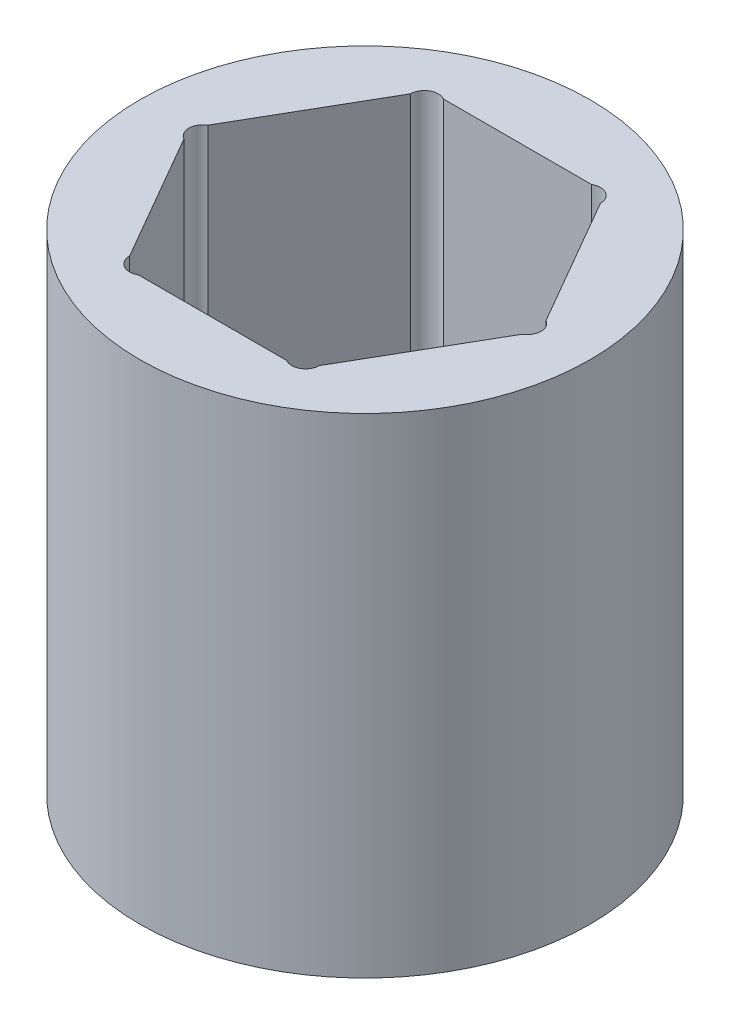
ISO-10303-21;
HEADER;
FILE_DESCRIPTION(('STEP AP214'),'2;1');
FILE_NAME('part.step','',(''),(''),'','','');
FILE_SCHEMA(('AUTOMOTIVE_DESIGN { 1 0 10303 214 1 1 1 1 }'));
ENDSEC;
DATA;
#1=APPLICATION_CONTEXT('core data for automotive mechanical design processes');
#2=APPLICATION_PROTOCOL_DEFINITION('international standard','automotive_design',2000,#1);
#3=PRODUCT_CONTEXT('',#1,'mechanical');
#4=PRODUCT('Part','Part','',(#3));
#5=PRODUCT_RELATED_PRODUCT_CATEGORY('part','',(#4));
#6=PRODUCT_DEFINITION_FORMATION('','',#4);
#7=PRODUCT_DEFINITION_CONTEXT('part definition',#1,'design');
#8=PRODUCT_DEFINITION('design','',#6,#7);
#9=PRODUCT_DEFINITION_SHAPE('','',#8);
#10=(LENGTH_UNIT() NAMED_UNIT(*) SI_UNIT(.MILLI.,.METRE.));
#11=(NAMED_UNIT(*) PLANE_ANGLE_UNIT() SI_UNIT($,.RADIAN.));
#12=(NAMED_UNIT(*) SI_UNIT($,.STERADIAN.) SOLID_ANGLE_UNIT());
#13=UNCERTAINTY_MEASURE_WITH_UNIT(LENGTH_MEASURE(1.E-05),#10,'distance_accuracy_value','');
#14=(GEOMETRIC_REPRESENTATION_CONTEXT(3) GLOBAL_UNCERTAINTY_ASSIGNED_CONTEXT((#13)) GLOBAL_UNIT_ASSIGNED_CONTEXT((#10,
#11,#12)) REPRESENTATION_CONTEXT('',''));
#15=CARTESIAN_POINT('',(0.,0.,0.));
#16=DIRECTION('',(0.,0.,1.));
#17=DIRECTION('',(1.,0.,0.));
#18=AXIS2_PLACEMENT_3D('',#15,#16,#17);
#19=CARTESIAN_POINT('',(-3.5128211777283,21.1836,-6.08438475772933));
#20=DIRECTION('',(0.,-1.,0.));
#21=DIRECTION('',(0.,0.,-1.));
#22=AXIS2_PLACEMENT_3D('',#19,#20,#21);
#23=CYLINDRICAL_SURFACE('',#22,0.600000000000001);
#24=CARTESIAN_POINT('',(-3.5128211777283,0.,-6.08438475772933));
#25=DIRECTION('',(0.,1.,0.));
#26=DIRECTION('',(0.,0.,1.));
#27=AXIS2_PLACEMENT_3D('',#24,#25,#26);
#28=CIRCLE('',#27,0.600000000000001);
#29=CARTESIAN_POINT('',(-3.2128211777283,0.,-6.604));
#30=VERTEX_POINT('',#29);
#31=CARTESIAN_POINT('',(-4.1128211777283,0.,-6.08438475772932));
#32=VERTEX_POINT('',#31);
#33=EDGE_CURVE('E158',#30,#32,#28,.T.);
#34=ORIENTED_EDGE('',*,*,#33,.F.);
#35=DIRECTION('',(0.,-1.,0.));
#36=VECTOR('',#35,1.);
#37=CARTESIAN_POINT('',(-3.2128211777283,21.1836,-6.604));
#38=LINE('',#37,#36);
#39=CARTESIAN_POINT('',(-3.2128211777283,21.1836,-6.604));
#40=VERTEX_POINT('',#39);
#41=EDGE_CURVE('E11',#40,#30,#38,.T.);
#42=ORIENTED_EDGE('',*,*,#41,.F.);
#43=CARTESIAN_POINT('',(-3.5128211777283,21.1836,-6.08438475772933));
#44=DIRECTION('',(0.,1.,0.));
#45=DIRECTION('',(0.,0.,1.));
#46=AXIS2_PLACEMENT_3D('',#43,#44,#45);
#47=CIRCLE('',#46,0.600000000000001);
#48=CARTESIAN_POINT('',(-4.1128211777283,21.1836,-6.08438475772932));
#49=VERTEX_POINT('',#48);
#50=EDGE_CURVE('E193',#40,#49,#47,.T.);
#51=ORIENTED_EDGE('',*,*,#50,.T.);
#52=DIRECTION('',(0.,-1.,0.));
#53=VECTOR('',#52,1.);
#54=CARTESIAN_POINT('',(-4.1128211777283,21.1836,-6.08438475772932));
#55=LINE('',#54,#53);
#56=EDGE_CURVE('E53',#49,#32,#55,.T.);
#57=ORIENTED_EDGE('',*,*,#56,.T.);
#58=EDGE_LOOP('',(#34,#42,#51,#57));
#59=FACE_BOUND('',#58,.T.);
#60=ADVANCED_FACE('F37',(#59),#23,.F.);
#61=CARTESIAN_POINT('',(0.,21.1836,-6.604));
#62=DIRECTION('',(0.,0.,1.));
#63=DIRECTION('',(1.,0.,0.));
#64=AXIS2_PLACEMENT_3D('',#61,#62,#63);
#65=PLANE('',#64);
#66=DIRECTION('',(-1.,0.,0.));
#67=VECTOR('',#66,1.);
#68=CARTESIAN_POINT('',(0.,0.,-6.604));
#69=LINE('',#68,#67);
#70=CARTESIAN_POINT('',(3.21282117772828,0.,-6.604));
#71=VERTEX_POINT('',#70);
#72=EDGE_CURVE('E160',#71,#30,#69,.T.);
#73=ORIENTED_EDGE('',*,*,#72,.F.);
#74=DIRECTION('',(0.,-1.,0.));
#75=VECTOR('',#74,1.);
#76=CARTESIAN_POINT('',(3.21282117772828,21.1836,-6.604));
#77=LINE('',#76,#75);
#78=CARTESIAN_POINT('',(3.21282117772828,21.1836,-6.604));
#79=VERTEX_POINT('',#78);
#80=EDGE_CURVE('E45',#79,#71,#77,.T.);
#81=ORIENTED_EDGE('',*,*,#80,.F.);
#82=DIRECTION('',(-1.,0.,0.));
#83=VECTOR('',#82,1.);
#84=CARTESIAN_POINT('',(0.,21.1836,-6.604));
#85=LINE('',#84,#83);
#86=EDGE_CURVE('E231',#79,#40,#85,.T.);
#87=ORIENTED_EDGE('',*,*,#86,.T.);
#88=ORIENTED_EDGE('',*,*,#41,.T.);
#89=EDGE_LOOP('',(#73,#81,#87,#88));
#90=FACE_BOUND('',#89,.T.);
#91=ADVANCED_FACE('F218',(#90),#65,.T.);
#92=CARTESIAN_POINT('',(3.51282117772829,21.1836,-6.08438475772934));
#93=DIRECTION('',(0.,-1.,0.));
#94=DIRECTION('',(0.,0.,-1.));
#95=AXIS2_PLACEMENT_3D('',#92,#93,#94);
#96=CYLINDRICAL_SURFACE('',#95,0.600000000000001);
#97=CARTESIAN_POINT('',(3.51282117772829,0.,-6.08438475772934));
#98=DIRECTION('',(0.,1.,0.));
#99=DIRECTION('',(0.,0.,1.));
#100=AXIS2_PLACEMENT_3D('',#97,#98,#99);
#101=CIRCLE('',#100,0.600000000000001);
#102=CARTESIAN_POINT('',(4.11282117772829,0.,-6.08438475772934));
#103=VERTEX_POINT('',#102);
#104=EDGE_CURVE('E163',#103,#71,#101,.T.);
#105=ORIENTED_EDGE('',*,*,#104,.F.);
#106=DIRECTION('',(0.,-1.,0.));
#107=VECTOR('',#106,1.);
#108=CARTESIAN_POINT('',(4.11282117772829,21.1836,-6.08438475772934));
#109=LINE('',#108,#107);
#110=CARTESIAN_POINT('',(4.11282117772829,21.1836,-6.08438475772934));
#111=VERTEX_POINT('',#110);
#112=EDGE_CURVE('E207',#111,#103,#109,.T.);
#113=ORIENTED_EDGE('',*,*,#112,.F.);
#114=CARTESIAN_POINT('',(3.51282117772829,21.1836,-6.08438475772934));
#115=DIRECTION('',(0.,1.,0.));
#116=DIRECTION('',(0.,0.,1.));
#117=AXIS2_PLACEMENT_3D('',#114,#115,#116);
#118=CIRCLE('',#117,0.600000000000001);
#119=EDGE_CURVE('E214',#111,#79,#118,.T.);
#120=ORIENTED_EDGE('',*,*,#119,.T.);
#121=ORIENTED_EDGE('',*,*,#80,.T.);
#122=EDGE_LOOP('',(#105,#113,#120,#121));
#123=FACE_BOUND('',#122,.T.);
#124=ADVANCED_FACE('F212',(#123),#96,.F.);
#125=CARTESIAN_POINT('',(5.71923176659243,21.1836,-3.302));
#126=DIRECTION('',(-0.866025403784438,0.,0.5));
#127=DIRECTION('',(0.5,0.,0.866025403784438));
#128=AXIS2_PLACEMENT_3D('',#125,#126,#127);
#129=PLANE('',#128);
#130=DIRECTION('',(-0.5,0.,-0.866025403784438));
#131=VECTOR('',#130,1.);
#132=CARTESIAN_POINT('',(5.71923176659243,0.,-3.302));
#133=LINE('',#132,#131);
#134=CARTESIAN_POINT('',(7.32564235545658,0.,-0.519615242270668));
#135=VERTEX_POINT('',#134);
#136=EDGE_CURVE('E166',#135,#103,#133,.T.);
#137=ORIENTED_EDGE('',*,*,#136,.F.);
#138=DIRECTION('',(0.,-1.,0.));
#139=VECTOR('',#138,1.);
#140=CARTESIAN_POINT('',(7.32564235545658,21.1836,-0.519615242270668));
#141=LINE('',#140,#139);
#142=CARTESIAN_POINT('',(7.32564235545658,21.1836,-0.519615242270668));
#143=VERTEX_POINT('',#142);
#144=EDGE_CURVE('E205',#143,#135,#141,.T.);
#145=ORIENTED_EDGE('',*,*,#144,.F.);
#146=DIRECTION('',(-0.5,0.,-0.866025403784438));
#147=VECTOR('',#146,1.);
#148=CARTESIAN_POINT('',(5.71923176659243,21.1836,-3.302));
#149=LINE('',#148,#147);
#150=EDGE_CURVE('E228',#143,#111,#149,.T.);
#151=ORIENTED_EDGE('',*,*,#150,.T.);
#152=ORIENTED_EDGE('',*,*,#112,.T.);
#153=EDGE_LOOP('',(#137,#145,#151,#152));
#154=FACE_BOUND('',#153,.T.);
#155=ADVANCED_FACE('F225',(#154),#129,.T.);
#156=CARTESIAN_POINT('',(7.02564235545658,21.1836,0.));
#157=DIRECTION('',(0.,-1.,0.));
#158=DIRECTION('',(0.,0.,-1.));
#159=AXIS2_PLACEMENT_3D('',#156,#157,#158);
#160=CYLINDRICAL_SURFACE('',#159,0.6);
#161=CARTESIAN_POINT('',(7.02564235545658,0.,0.));
#162=DIRECTION('',(0.,1.,0.));
#163=DIRECTION('',(0.,0.,1.));
#164=AXIS2_PLACEMENT_3D('',#161,#162,#163);
#165=CIRCLE('',#164,0.6);
#166=CARTESIAN_POINT('',(7.32564235545658,0.,0.519615242270659));
#167=VERTEX_POINT('',#166);
#168=EDGE_CURVE('E169',#167,#135,#165,.T.);
#169=ORIENTED_EDGE('',*,*,#168,.F.);
#170=DIRECTION('',(0.,-1.,0.));
#171=VECTOR('',#170,1.);
#172=CARTESIAN_POINT('',(7.32564235545658,21.1836,0.519615242270659));
#173=LINE('',#172,#171);
#174=CARTESIAN_POINT('',(7.32564235545658,21.1836,0.519615242270659));
#175=VERTEX_POINT('',#174);
#176=EDGE_CURVE('E203',#175,#167,#173,.T.);
#177=ORIENTED_EDGE('',*,*,#176,.F.);
#178=CARTESIAN_POINT('',(7.02564235545658,21.1836,0.));
#179=DIRECTION('',(0.,1.,0.));
#180=DIRECTION('',(0.,0.,1.));
#181=AXIS2_PLACEMENT_3D('',#178,#179,#180);
#182=CIRCLE('',#181,0.6);
#183=EDGE_CURVE('E233',#175,#143,#182,.T.);
#184=ORIENTED_EDGE('',*,*,#183,.T.);
#185=ORIENTED_EDGE('',*,*,#144,.T.);
#186=EDGE_LOOP('',(#169,#177,#184,#185));
#187=FACE_BOUND('',#186,.T.);
#188=ADVANCED_FACE('F273',(#187),#160,.F.);
#189=CARTESIAN_POINT('',(5.71923176659244,21.1836,3.302));
#190=DIRECTION('',(-0.866025403784439,0.,-0.499999999999999));
#191=DIRECTION('',(-0.499999999999999,0.,0.866025403784439));
#192=AXIS2_PLACEMENT_3D('',#189,#190,#191);
#193=PLANE('',#192);
#194=DIRECTION('',(0.499999999999999,0.,-0.866025403784439));
#195=VECTOR('',#194,1.);
#196=CARTESIAN_POINT('',(5.71923176659244,0.,3.302));
#197=LINE('',#196,#195);
#198=CARTESIAN_POINT('',(4.11282117772829,0.,6.08438475772933));
#199=VERTEX_POINT('',#198);
#200=EDGE_CURVE('E172',#199,#167,#197,.T.);
#201=ORIENTED_EDGE('',*,*,#200,.F.);
#202=DIRECTION('',(0.,-1.,0.));
#203=VECTOR('',#202,1.);
#204=CARTESIAN_POINT('',(4.11282117772829,21.1836,6.08438475772933));
#205=LINE('',#204,#203);
#206=CARTESIAN_POINT('',(4.11282117772829,21.1836,6.08438475772933));
#207=VERTEX_POINT('',#206);
#208=EDGE_CURVE('E201',#207,#199,#205,.T.);
#209=ORIENTED_EDGE('',*,*,#208,.F.);
#210=DIRECTION('',(0.499999999999999,0.,-0.866025403784439));
#211=VECTOR('',#210,1.);
#212=CARTESIAN_POINT('',(5.71923176659244,21.1836,3.302));
#213=LINE('',#212,#211);
#214=EDGE_CURVE('E239',#207,#175,#213,.T.);
#215=ORIENTED_EDGE('',*,*,#214,.T.);
#216=ORIENTED_EDGE('',*,*,#176,.T.);
#217=EDGE_LOOP('',(#201,#209,#215,#216));
#218=FACE_BOUND('',#217,.T.);
#219=ADVANCED_FACE('F276',(#218),#193,.T.);
#220=CARTESIAN_POINT('',(3.51282117772829,21.1836,6.08438475772933));
#221=DIRECTION('',(0.,-1.,0.));
#222=DIRECTION('',(0.,0.,-1.));
#223=AXIS2_PLACEMENT_3D('',#220,#221,#222);
#224=CYLINDRICAL_SURFACE('',#223,0.600000000000001);
#225=CARTESIAN_POINT('',(3.51282117772829,0.,6.08438475772933));
#226=DIRECTION('',(0.,1.,0.));
#227=DIRECTION('',(0.,0.,1.));
#228=AXIS2_PLACEMENT_3D('',#225,#226,#227);
#229=CIRCLE('',#228,0.600000000000001);
#230=CARTESIAN_POINT('',(3.21282117772829,0.,6.604));
#231=VERTEX_POINT('',#230);
#232=EDGE_CURVE('E175',#231,#199,#229,.T.);
#233=ORIENTED_EDGE('',*,*,#232,.F.);
#234=DIRECTION('',(0.,-1.,0.));
#235=VECTOR('',#234,1.);
#236=CARTESIAN_POINT('',(3.21282117772829,21.1836,6.604));
#237=LINE('',#236,#235);
#238=CARTESIAN_POINT('',(3.21282117772829,21.1836,6.604));
#239=VERTEX_POINT('',#238);
#240=EDGE_CURVE('E199',#239,#231,#237,.T.);
#241=ORIENTED_EDGE('',*,*,#240,.F.);
#242=CARTESIAN_POINT('',(3.51282117772829,21.1836,6.08438475772933));
#243=DIRECTION('',(0.,1.,0.));
#244=DIRECTION('',(0.,0.,1.));
#245=AXIS2_PLACEMENT_3D('',#242,#243,#244);
#246=CIRCLE('',#245,0.600000000000001);
#247=EDGE_CURVE('E242',#239,#207,#246,.T.);
#248=ORIENTED_EDGE('',*,*,#247,.T.);
#249=ORIENTED_EDGE('',*,*,#208,.T.);
#250=EDGE_LOOP('',(#233,#241,#248,#249));
#251=FACE_BOUND('',#250,.T.);
#252=ADVANCED_FACE('F280',(#251),#224,.F.);
#253=CARTESIAN_POINT('',(0.,21.1836,6.604));
#254=DIRECTION('',(0.,0.,-1.));
#255=DIRECTION('',(-1.,0.,0.));
#256=AXIS2_PLACEMENT_3D('',#253,#254,#255);
#257=PLANE('',#256);
#258=DIRECTION('',(1.,0.,0.));
#259=VECTOR('',#258,1.);
#260=CARTESIAN_POINT('',(0.,0.,6.604));
#261=LINE('',#260,#259);
#262=CARTESIAN_POINT('',(-3.21282117772829,0.,6.604));
#263=VERTEX_POINT('',#262);
#264=EDGE_CURVE('E178',#263,#231,#261,.T.);
#265=ORIENTED_EDGE('',*,*,#264,.F.);
#266=DIRECTION('',(0.,-1.,0.));
#267=VECTOR('',#266,1.);
#268=CARTESIAN_POINT('',(-3.21282117772829,21.1836,6.604));
#269=LINE('',#268,#267);
#270=CARTESIAN_POINT('',(-3.21282117772829,21.1836,6.604));
#271=VERTEX_POINT('',#270);
#272=EDGE_CURVE('E197',#271,#263,#269,.T.);
#273=ORIENTED_EDGE('',*,*,#272,.F.);
#274=DIRECTION('',(1.,0.,0.));
#275=VECTOR('',#274,1.);
#276=CARTESIAN_POINT('',(0.,21.1836,6.604));
#277=LINE('',#276,#275);
#278=EDGE_CURVE('E245',#271,#239,#277,.T.);
#279=ORIENTED_EDGE('',*,*,#278,.T.);
#280=ORIENTED_EDGE('',*,*,#240,.T.);
#281=EDGE_LOOP('',(#265,#273,#279,#280));
#282=FACE_BOUND('',#281,.T.);
#283=ADVANCED_FACE('F284',(#282),#257,.T.);
#284=CARTESIAN_POINT('',(-3.51282117772829,21.1836,6.08438475772934));
#285=DIRECTION('',(0.,-1.,0.));
#286=DIRECTION('',(0.,0.,-1.));
#287=AXIS2_PLACEMENT_3D('',#284,#285,#286);
#288=CYLINDRICAL_SURFACE('',#287,0.6);
#289=CARTESIAN_POINT('',(-3.51282117772829,0.,6.08438475772934));
#290=DIRECTION('',(0.,1.,0.));
#291=DIRECTION('',(0.,0.,1.));
#292=AXIS2_PLACEMENT_3D('',#289,#290,#291);
#293=CIRCLE('',#292,0.6);
#294=CARTESIAN_POINT('',(-4.11282117772828,0.,6.08438475772934));
#295=VERTEX_POINT('',#294);
#296=EDGE_CURVE('E181',#295,#263,#293,.T.);
#297=ORIENTED_EDGE('',*,*,#296,.F.);
#298=DIRECTION('',(0.,-1.,0.));
#299=VECTOR('',#298,1.);
#300=CARTESIAN_POINT('',(-4.11282117772828,21.1836,6.08438475772934));
#301=LINE('',#300,#299);
#302=CARTESIAN_POINT('',(-4.11282117772828,21.1836,6.08438475772934));
#303=VERTEX_POINT('',#302);
#304=EDGE_CURVE('E136',#303,#295,#301,.T.);
#305=ORIENTED_EDGE('',*,*,#304,.F.);
#306=CARTESIAN_POINT('',(-3.51282117772829,21.1836,6.08438475772934));
#307=DIRECTION('',(0.,1.,0.));
#308=DIRECTION('',(0.,0.,1.));
#309=AXIS2_PLACEMENT_3D('',#306,#307,#308);
#310=CIRCLE('',#309,0.6);
#311=EDGE_CURVE('E147',#303,#271,#310,.T.);
#312=ORIENTED_EDGE('',*,*,#311,.T.);
#313=ORIENTED_EDGE('',*,*,#272,.T.);
#314=EDGE_LOOP('',(#297,#305,#312,#313));
#315=FACE_BOUND('',#314,.T.);
#316=ADVANCED_FACE('F249',(#315),#288,.F.);
#317=CARTESIAN_POINT('',(-5.71923176659243,21.1836,3.302));
#318=DIRECTION('',(0.866025403784438,0.,-0.500000000000001));
#319=DIRECTION('',(-0.500000000000001,0.,-0.866025403784438));
#320=AXIS2_PLACEMENT_3D('',#317,#318,#319);
#321=PLANE('',#320);
#322=DIRECTION('',(0.500000000000001,0.,0.866025403784438));
#323=VECTOR('',#322,1.);
#324=CARTESIAN_POINT('',(-5.71923176659243,0.,3.302));
#325=LINE('',#324,#323);
#326=CARTESIAN_POINT('',(-7.32564235545657,0.,0.519615242270671));
#327=VERTEX_POINT('',#326);
#328=EDGE_CURVE('E132',#327,#295,#325,.T.);
#329=ORIENTED_EDGE('',*,*,#328,.F.);
#330=DIRECTION('',(0.,-1.,0.));
#331=VECTOR('',#330,1.);
#332=CARTESIAN_POINT('',(-7.32564235545657,21.1836,0.519615242270671));
#333=LINE('',#332,#331);
#334=CARTESIAN_POINT('',(-7.32564235545657,21.1836,0.519615242270671));
#335=VERTEX_POINT('',#334);
#336=EDGE_CURVE('E127',#335,#327,#333,.T.);
#337=ORIENTED_EDGE('',*,*,#336,.F.);
#338=DIRECTION('',(0.500000000000001,0.,0.866025403784438));
#339=VECTOR('',#338,1.);
#340=CARTESIAN_POINT('',(-5.71923176659243,21.1836,3.302));
#341=LINE('',#340,#339);
#342=EDGE_CURVE('E130',#335,#303,#341,.T.);
#343=ORIENTED_EDGE('',*,*,#342,.T.);
#344=ORIENTED_EDGE('',*,*,#304,.T.);
#345=EDGE_LOOP('',(#329,#337,#343,#344));
#346=FACE_BOUND('',#345,.T.);
#347=ADVANCED_FACE('F129',(#346),#321,.T.);
#348=CARTESIAN_POINT('',(-7.02564235545658,21.1836,0.));
#349=DIRECTION('',(0.,-1.,0.));
#350=DIRECTION('',(0.,0.,-1.));
#351=AXIS2_PLACEMENT_3D('',#348,#349,#350);
#352=CYLINDRICAL_SURFACE('',#351,0.6);
#353=CARTESIAN_POINT('',(-7.02564235545658,0.,0.));
#354=DIRECTION('',(0.,1.,0.));
#355=DIRECTION('',(0.,0.,1.));
#356=AXIS2_PLACEMENT_3D('',#353,#354,#355);
#357=CIRCLE('',#356,0.6);
#358=CARTESIAN_POINT('',(-7.32564235545658,0.,-0.519615242270657));
#359=VERTEX_POINT('',#358);
#360=EDGE_CURVE('E185',#359,#327,#357,.T.);
#361=ORIENTED_EDGE('',*,*,#360,.F.);
#362=DIRECTION('',(0.,-1.,0.));
#363=VECTOR('',#362,1.);
#364=CARTESIAN_POINT('',(-7.32564235545658,21.1836,-0.519615242270657));
#365=LINE('',#364,#363);
#366=CARTESIAN_POINT('',(-7.32564235545658,21.1836,-0.519615242270657));
#367=VERTEX_POINT('',#366);
#368=EDGE_CURVE('E90',#367,#359,#365,.T.);
#369=ORIENTED_EDGE('',*,*,#368,.F.);
#370=CARTESIAN_POINT('',(-7.02564235545658,21.1836,0.));
#371=DIRECTION('',(0.,1.,0.));
#372=DIRECTION('',(0.,0.,1.));
#373=AXIS2_PLACEMENT_3D('',#370,#371,#372);
#374=CIRCLE('',#373,0.6);
#375=EDGE_CURVE('E144',#367,#335,#374,.T.);
#376=ORIENTED_EDGE('',*,*,#375,.T.);
#377=ORIENTED_EDGE('',*,*,#336,.T.);
#378=EDGE_LOOP('',(#361,#369,#376,#377));
#379=FACE_BOUND('',#378,.T.);
#380=ADVANCED_FACE('F149',(#379),#352,.F.);
#381=CARTESIAN_POINT('',(-5.71923176659243,21.1836,-3.302));
#382=DIRECTION('',(0.866025403784439,0.,0.5));
#383=DIRECTION('',(0.5,0.,-0.866025403784439));
#384=AXIS2_PLACEMENT_3D('',#381,#382,#383);
#385=PLANE('',#384);
#386=DIRECTION('',(-0.5,0.,0.866025403784439));
#387=VECTOR('',#386,1.);
#388=CARTESIAN_POINT('',(-5.71923176659243,0.,-3.302));
#389=LINE('',#388,#387);
#390=EDGE_CURVE('E187',#32,#359,#389,.T.);
#391=ORIENTED_EDGE('',*,*,#390,.F.);
#392=ORIENTED_EDGE('',*,*,#56,.F.);
#393=DIRECTION('',(-0.5,0.,0.866025403784439));
#394=VECTOR('',#393,1.);
#395=CARTESIAN_POINT('',(-5.71923176659243,21.1836,-3.302));
#396=LINE('',#395,#394);
#397=EDGE_CURVE('E150',#49,#367,#396,.T.);
#398=ORIENTED_EDGE('',*,*,#397,.T.);
#399=ORIENTED_EDGE('',*,*,#368,.T.);
#400=EDGE_LOOP('',(#391,#392,#398,#399));
#401=FACE_BOUND('',#400,.T.);
#402=ADVANCED_FACE('F251',(#401),#385,.T.);
#403=CARTESIAN_POINT('',(0.,21.1836,0.));
#404=DIRECTION('',(0.,-1.,0.));
#405=DIRECTION('',(0.,0.,-1.));
#406=AXIS2_PLACEMENT_3D('',#403,#404,#405);
#407=CYLINDRICAL_SURFACE('',#406,9.7536);
#408=CARTESIAN_POINT('',(0.,21.1836,0.));
#409=DIRECTION('',(0.,1.,0.));
#410=DIRECTION('',(0.,0.,1.));
#411=AXIS2_PLACEMENT_3D('',#408,#409,#410);
#412=CIRCLE('',#411,9.7536);
#413=CARTESIAN_POINT('',(0.,21.1836,9.7536));
#414=VERTEX_POINT('',#413);
#415=EDGE_CURVE('E152',#414,#414,#412,.T.);
#416=ORIENTED_EDGE('',*,*,#415,.F.);
#417=EDGE_LOOP('',(#416));
#418=FACE_BOUND('',#417,.T.);
#419=CARTESIAN_POINT('',(0.,0.,0.));
#420=DIRECTION('',(0.,1.,0.));
#421=DIRECTION('',(0.,0.,1.));
#422=AXIS2_PLACEMENT_3D('',#419,#420,#421);
#423=CIRCLE('',#422,9.7536);
#424=CARTESIAN_POINT('',(0.,0.,9.7536));
#425=VERTEX_POINT('',#424);
#426=EDGE_CURVE('E190',#425,#425,#423,.T.);
#427=ORIENTED_EDGE('',*,*,#426,.T.);
#428=EDGE_LOOP('',(#427));
#429=FACE_BOUND('',#428,.T.);
#430=ADVANCED_FACE('F253',(#418,#429),#407,.T.);
#431=CARTESIAN_POINT('',(0.,21.1836,0.));
#432=DIRECTION('',(0.,1.,0.));
#433=DIRECTION('',(0.,0.,1.));
#434=AXIS2_PLACEMENT_3D('',#431,#432,#433);
#435=PLANE('',#434);
#436=ORIENTED_EDGE('',*,*,#50,.F.);
#437=ORIENTED_EDGE('',*,*,#86,.F.);
#438=ORIENTED_EDGE('',*,*,#119,.F.);
#439=ORIENTED_EDGE('',*,*,#150,.F.);
#440=ORIENTED_EDGE('',*,*,#183,.F.);
#441=ORIENTED_EDGE('',*,*,#214,.F.);
#442=ORIENTED_EDGE('',*,*,#247,.F.);
#443=ORIENTED_EDGE('',*,*,#278,.F.);
#444=ORIENTED_EDGE('',*,*,#311,.F.);
#445=ORIENTED_EDGE('',*,*,#342,.F.);
#446=ORIENTED_EDGE('',*,*,#375,.F.);
#447=ORIENTED_EDGE('',*,*,#397,.F.);
#448=EDGE_LOOP('',(#436,#437,#438,#439,#440,#441,#442,#443,#444,#445,#446,#447));
#449=FACE_BOUND('',#448,.T.);
#450=ORIENTED_EDGE('',*,*,#415,.T.);
#451=EDGE_LOOP('',(#450));
#452=FACE_BOUND('',#451,.T.);
#453=ADVANCED_FACE('F141',(#449,#452),#435,.T.);
#454=CARTESIAN_POINT('',(0.,0.,0.));
#455=DIRECTION('',(0.,1.,0.));
#456=DIRECTION('',(0.,0.,1.));
#457=AXIS2_PLACEMENT_3D('',#454,#455,#456);
#458=PLANE('',#457);
#459=ORIENTED_EDGE('',*,*,#33,.T.);
#460=ORIENTED_EDGE('',*,*,#390,.T.);
#461=ORIENTED_EDGE('',*,*,#360,.T.);
#462=ORIENTED_EDGE('',*,*,#328,.T.);
#463=ORIENTED_EDGE('',*,*,#296,.T.);
#464=ORIENTED_EDGE('',*,*,#264,.T.);
#465=ORIENTED_EDGE('',*,*,#232,.T.);
#466=ORIENTED_EDGE('',*,*,#200,.T.);
#467=ORIENTED_EDGE('',*,*,#168,.T.);
#468=ORIENTED_EDGE('',*,*,#136,.T.);
#469=ORIENTED_EDGE('',*,*,#104,.T.);
#470=ORIENTED_EDGE('',*,*,#72,.T.);
#471=EDGE_LOOP('',(#459,#460,#461,#462,#463,#464,#465,#466,#467,#468,#469,#470));
#472=FACE_BOUND('',#471,.T.);
#473=ORIENTED_EDGE('',*,*,#426,.F.);
#474=EDGE_LOOP('',(#473));
#475=FACE_BOUND('',#474,.T.);
#476=ADVANCED_FACE('F220',(#472,#475),#458,.F.);
#477=CLOSED_SHELL('',(#60,#91,#124,#155,#188,#219,#252,#283,#316,#347,#380,#402,#430,#453,#476));
#478=MANIFOLD_SOLID_BREP('B2',#477);
#479=ADVANCED_BREP_SHAPE_REPRESENTATION('',(#18,#478),#14);
#480=SHAPE_DEFINITION_REPRESENTATION(#9,#479);
ENDSEC;
END-ISO-10303-21;
